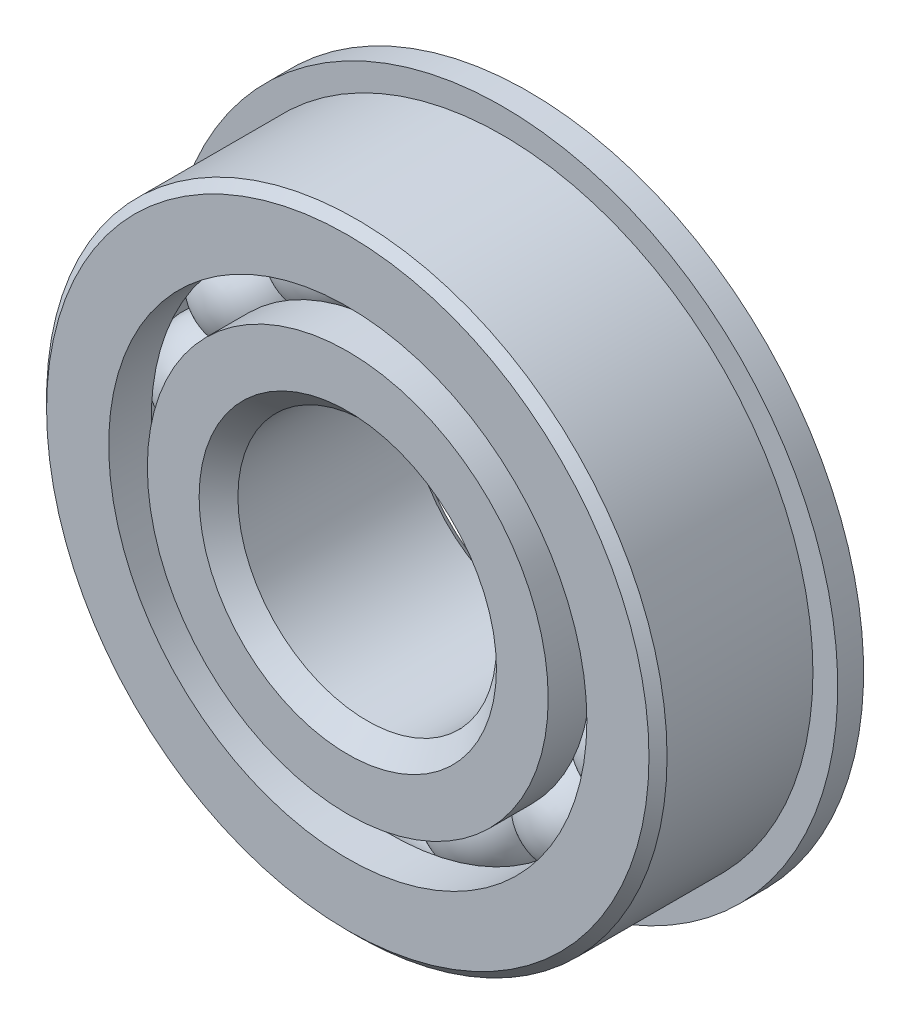
ISO-10303-21;
HEADER;
FILE_DESCRIPTION(('STEP AP214'),'2;1');
FILE_NAME('part.step','',(''),(''),'','','');
FILE_SCHEMA(('AUTOMOTIVE_DESIGN { 1 0 10303 214 1 1 1 1 }'));
ENDSEC;
DATA;
#1=APPLICATION_CONTEXT('core data for automotive mechanical design processes');
#2=APPLICATION_PROTOCOL_DEFINITION('international standard','automotive_design',2000,#1);
#3=PRODUCT_CONTEXT('',#1,'mechanical');
#4=PRODUCT('Part','Part','',(#3));
#5=PRODUCT_RELATED_PRODUCT_CATEGORY('part','',(#4));
#6=PRODUCT_DEFINITION_FORMATION('','',#4);
#7=PRODUCT_DEFINITION_CONTEXT('part definition',#1,'design');
#8=PRODUCT_DEFINITION('design','',#6,#7);
#9=PRODUCT_DEFINITION_SHAPE('','',#8);
#10=(LENGTH_UNIT() NAMED_UNIT(*) SI_UNIT(.MILLI.,.METRE.));
#11=(NAMED_UNIT(*) PLANE_ANGLE_UNIT() SI_UNIT($,.RADIAN.));
#12=(NAMED_UNIT(*) SI_UNIT($,.STERADIAN.) SOLID_ANGLE_UNIT());
#13=UNCERTAINTY_MEASURE_WITH_UNIT(LENGTH_MEASURE(1.E-05),#10,'distance_accuracy_value','');
#14=(GEOMETRIC_REPRESENTATION_CONTEXT(3) GLOBAL_UNCERTAINTY_ASSIGNED_CONTEXT((#13)) GLOBAL_UNIT_ASSIGNED_CONTEXT((#10,
#11,#12)) REPRESENTATION_CONTEXT('',''));
#15=CARTESIAN_POINT('',(0.,0.,0.));
#16=DIRECTION('',(0.,0.,1.));
#17=DIRECTION('',(1.,0.,0.));
#18=AXIS2_PLACEMENT_3D('',#15,#16,#17);
#19=CARTESIAN_POINT('',(-6.27085830276545,11.9481222461581,0.));
#20=DIRECTION('',(0.,0.,1.));
#21=DIRECTION('',(-0.464723172043757,0.885456025653216,0.));
#22=AXIS2_PLACEMENT_3D('',#19,#20,#21);
#23=SPHERICAL_SURFACE('',#22,3.175);
#24=CARTESIAN_POINT('',(-6.27085830276545,11.9481222461581,3.175));
#25=VERTEX_POINT('',#24);
#26=VERTEX_LOOP('',#25);
#27=FACE_BOUND('',#26,.T.);
#28=ADVANCED_FACE('F39',(#27),#23,.T.);
#29=CLOSED_SHELL('',(#28));
#30=MANIFOLD_SOLID_BREP('B2',#29);
#31=CARTESIAN_POINT('',(-11.1051385404024,7.66532367620367,0.));
#32=DIRECTION('',(0.,0.,1.));
#33=DIRECTION('',(-0.822983865893649,0.568064746731166,0.));
#34=AXIS2_PLACEMENT_3D('',#31,#32,#33);
#35=SPHERICAL_SURFACE('',#34,3.175);
#36=CARTESIAN_POINT('',(-11.1051385404024,7.66532367620367,3.175));
#37=VERTEX_POINT('',#36);
#38=VERTEX_LOOP('',#37);
#39=FACE_BOUND('',#38,.T.);
#40=ADVANCED_FACE('F60',(#39),#35,.T.);
#41=CLOSED_SHELL('',(#40));
#42=MANIFOLD_SOLID_BREP('B6',#41);
#43=CARTESIAN_POINT('',(-13.3953653698606,1.62649182919541,0.));
#44=DIRECTION('',(0.,0.,1.));
#45=DIRECTION('',(-0.992708874098053,0.120536680255334,0.));
#46=AXIS2_PLACEMENT_3D('',#43,#44,#45);
#47=SPHERICAL_SURFACE('',#46,3.175);
#48=CARTESIAN_POINT('',(-13.3953653698606,1.62649182919541,3.175));
#49=VERTEX_POINT('',#48);
#50=VERTEX_LOOP('',#49);
#51=FACE_BOUND('',#50,.T.);
#52=ADVANCED_FACE('F81',(#51),#47,.T.);
#53=CLOSED_SHELL('',(#52));
#54=MANIFOLD_SOLID_BREP('B35',#53);
#55=CARTESIAN_POINT('',(-12.6168754247364,-4.7849496945301,0.));
#56=DIRECTION('',(0.,0.,1.));
#57=DIRECTION('',(-0.935016242685418,-0.354604887042527,0.));
#58=AXIS2_PLACEMENT_3D('',#55,#56,#57);
#59=SPHERICAL_SURFACE('',#58,3.175);
#60=CARTESIAN_POINT('',(-12.6168754247364,-4.7849496945301,3.175));
#61=VERTEX_POINT('',#60);
#62=VERTEX_LOOP('',#61);
#63=FACE_BOUND('',#62,.T.);
#64=ADVANCED_FACE('F102',(#63),#59,.T.);
#65=CLOSED_SHELL('',(#64));
#66=MANIFOLD_SOLID_BREP('B56',#65);
#67=CARTESIAN_POINT('',(-8.94801136963682,-10.1002169081337,0.));
#68=DIRECTION('',(0.,0.,1.));
#69=DIRECTION('',(-0.663122658240802,-0.748510748171095,0.));
#70=AXIS2_PLACEMENT_3D('',#67,#68,#69);
#71=SPHERICAL_SURFACE('',#70,3.175);
#72=CARTESIAN_POINT('',(-8.94801136963682,-10.1002169081337,3.175));
#73=VERTEX_POINT('',#72);
#74=VERTEX_LOOP('',#73);
#75=FACE_BOUND('',#74,.T.);
#76=ADVANCED_FACE('F123',(#75),#71,.T.);
#77=CLOSED_SHELL('',(#76));
#78=MANIFOLD_SOLID_BREP('B77',#77);
#79=CARTESIAN_POINT('',(-3.22926574498033,-13.1016461488928,0.));
#80=DIRECTION('',(0.,0.,1.));
#81=DIRECTION('',(-0.239315664287565,-0.97094181742605,0.));
#82=AXIS2_PLACEMENT_3D('',#79,#80,#81);
#83=SPHERICAL_SURFACE('',#82,3.175);
#84=CARTESIAN_POINT('',(-3.22926574498033,-13.1016461488928,3.175));
#85=VERTEX_POINT('',#84);
#86=VERTEX_LOOP('',#85);
#87=FACE_BOUND('',#86,.T.);
#88=ADVANCED_FACE('F144',(#87),#83,.T.);
#89=CLOSED_SHELL('',(#88));
#90=MANIFOLD_SOLID_BREP('B98',#89);
#91=CARTESIAN_POINT('',(3.22926574498015,-13.1016461488928,0.));
#92=DIRECTION('',(0.,0.,1.));
#93=DIRECTION('',(0.239315664287552,-0.970941817426054,0.));
#94=AXIS2_PLACEMENT_3D('',#91,#92,#93);
#95=SPHERICAL_SURFACE('',#94,3.175);
#96=CARTESIAN_POINT('',(3.22926574498015,-13.1016461488928,3.175));
#97=VERTEX_POINT('',#96);
#98=VERTEX_LOOP('',#97);
#99=FACE_BOUND('',#98,.T.);
#100=ADVANCED_FACE('F165',(#99),#95,.T.);
#101=CLOSED_SHELL('',(#100));
#102=MANIFOLD_SOLID_BREP('B119',#101);
#103=CARTESIAN_POINT('',(8.94801136963668,-10.1002169081338,0.));
#104=DIRECTION('',(0.,0.,1.));
#105=DIRECTION('',(0.663122658240791,-0.748510748171105,0.));
#106=AXIS2_PLACEMENT_3D('',#103,#104,#105);
#107=SPHERICAL_SURFACE('',#106,3.175);
#108=CARTESIAN_POINT('',(8.94801136963668,-10.1002169081338,3.175));
#109=VERTEX_POINT('',#108);
#110=VERTEX_LOOP('',#109);
#111=FACE_BOUND('',#110,.T.);
#112=ADVANCED_FACE('F186',(#111),#107,.T.);
#113=CLOSED_SHELL('',(#112));
#114=MANIFOLD_SOLID_BREP('B140',#113);
#115=CARTESIAN_POINT('',(12.6168754247363,-4.78494969453027,0.));
#116=DIRECTION('',(0.,0.,1.));
#117=DIRECTION('',(0.935016242685413,-0.35460488704254,0.));
#118=AXIS2_PLACEMENT_3D('',#115,#116,#117);
#119=SPHERICAL_SURFACE('',#118,3.175);
#120=CARTESIAN_POINT('',(12.6168754247363,-4.78494969453027,3.175));
#121=VERTEX_POINT('',#120);
#122=VERTEX_LOOP('',#121);
#123=FACE_BOUND('',#122,.T.);
#124=ADVANCED_FACE('F207',(#123),#119,.T.);
#125=CLOSED_SHELL('',(#124));
#126=MANIFOLD_SOLID_BREP('B161',#125);
#127=CARTESIAN_POINT('',(13.3953653698606,1.62649182919522,0.));
#128=DIRECTION('',(0.,0.,1.));
#129=DIRECTION('',(0.992708874098054,0.12053668025532,0.));
#130=AXIS2_PLACEMENT_3D('',#127,#128,#129);
#131=SPHERICAL_SURFACE('',#130,3.175);
#132=CARTESIAN_POINT('',(13.3953653698606,1.62649182919522,3.175));
#133=VERTEX_POINT('',#132);
#134=VERTEX_LOOP('',#133);
#135=FACE_BOUND('',#134,.T.);
#136=ADVANCED_FACE('F228',(#135),#131,.T.);
#137=CLOSED_SHELL('',(#136));
#138=MANIFOLD_SOLID_BREP('B182',#137);
#139=CARTESIAN_POINT('',(11.1051385404025,7.66532367620351,0.));
#140=DIRECTION('',(0.,0.,1.));
#141=DIRECTION('',(0.822983865893658,0.568064746731154,0.));
#142=AXIS2_PLACEMENT_3D('',#139,#140,#141);
#143=SPHERICAL_SURFACE('',#142,3.175);
#144=CARTESIAN_POINT('',(11.1051385404025,7.66532367620351,3.175));
#145=VERTEX_POINT('',#144);
#146=VERTEX_LOOP('',#145);
#147=FACE_BOUND('',#146,.T.);
#148=ADVANCED_FACE('F249',(#147),#143,.T.);
#149=CLOSED_SHELL('',(#148));
#150=MANIFOLD_SOLID_BREP('B203',#149);
#151=CARTESIAN_POINT('',(6.27085830276562,11.948122246158,0.));
#152=DIRECTION('',(0.,0.,1.));
#153=DIRECTION('',(0.46472317204377,0.885456025653209,0.));
#154=AXIS2_PLACEMENT_3D('',#151,#152,#153);
#155=SPHERICAL_SURFACE('',#154,3.175);
#156=CARTESIAN_POINT('',(6.27085830276562,11.948122246158,3.175));
#157=VERTEX_POINT('',#156);
#158=VERTEX_LOOP('',#157);
#159=FACE_BOUND('',#158,.T.);
#160=ADVANCED_FACE('F270',(#159),#155,.T.);
#161=CLOSED_SHELL('',(#160));
#162=MANIFOLD_SOLID_BREP('B224',#161);
#163=CARTESIAN_POINT('',(0.,13.49375,0.));
#164=DIRECTION('',(0.,0.,1.));
#165=DIRECTION('',(0.,1.,0.));
#166=AXIS2_PLACEMENT_3D('',#163,#164,#165);
#167=SPHERICAL_SURFACE('',#166,3.175);
#168=CARTESIAN_POINT('',(0.,13.49375,3.175));
#169=VERTEX_POINT('',#168);
#170=VERTEX_LOOP('',#169);
#171=FACE_BOUND('',#170,.T.);
#172=ADVANCED_FACE('F292',(#171),#167,.T.);
#173=CLOSED_SHELL('',(#172));
#174=MANIFOLD_SOLID_BREP('B245',#173);
#175=CARTESIAN_POINT('',(0.,0.,5.5499));
#176=DIRECTION('',(0.,0.,1.));
#177=DIRECTION('',(1.,0.,0.));
#178=AXIS2_PLACEMENT_3D('',#175,#176,#177);
#179=CYLINDRICAL_SURFACE('',#178,12.306928021978);
#180=CARTESIAN_POINT('',(0.,0.,-2.94483931522316));
#181=DIRECTION('',(0.,0.,1.));
#182=DIRECTION('',(1.,0.,0.));
#183=AXIS2_PLACEMENT_3D('',#180,#181,#182);
#184=CIRCLE('',#183,12.306928021978);
#185=CARTESIAN_POINT('',(12.306928021978,0.,-2.94483931522316));
#186=VERTEX_POINT('',#185);
#187=EDGE_CURVE('E323',#186,#186,#184,.T.);
#188=ORIENTED_EDGE('',*,*,#187,.F.);
#189=EDGE_LOOP('',(#188));
#190=FACE_BOUND('',#189,.T.);
#191=CARTESIAN_POINT('',(0.,0.,-6.753225));
#192=DIRECTION('',(0.,0.,1.));
#193=DIRECTION('',(1.,0.,0.));
#194=AXIS2_PLACEMENT_3D('',#191,#192,#193);
#195=CIRCLE('',#194,12.306928021978);
#196=CARTESIAN_POINT('',(12.306928021978,0.,-6.753225));
#197=VERTEX_POINT('',#196);
#198=EDGE_CURVE('E327',#197,#197,#195,.T.);
#199=ORIENTED_EDGE('',*,*,#198,.T.);
#200=EDGE_LOOP('',(#199));
#201=FACE_BOUND('',#200,.T.);
#202=ADVANCED_FACE('F312',(#190,#201),#179,.T.);
#203=CARTESIAN_POINT('',(0.,8.49249,-6.753225));
#204=DIRECTION('',(0.,0.,1.));
#205=DIRECTION('',(1.,0.,0.));
#206=AXIS2_PLACEMENT_3D('',#203,#204,#205);
#207=PLANE('',#206);
#208=ORIENTED_EDGE('',*,*,#198,.F.);
#209=EDGE_LOOP('',(#208));
#210=FACE_BOUND('',#209,.T.);
#211=CARTESIAN_POINT('',(0.,0.,-6.753225));
#212=DIRECTION('',(0.,0.,1.));
#213=DIRECTION('',(1.,0.,0.));
#214=AXIS2_PLACEMENT_3D('',#211,#212,#213);
#215=CIRCLE('',#214,8.49249);
#216=CARTESIAN_POINT('',(8.49249,0.,-6.753225));
#217=VERTEX_POINT('',#216);
#218=EDGE_CURVE('E332',#217,#217,#215,.T.);
#219=ORIENTED_EDGE('',*,*,#218,.T.);
#220=EDGE_LOOP('',(#219));
#221=FACE_BOUND('',#220,.T.);
#222=ADVANCED_FACE('F359',(#210,#221),#207,.F.);
#223=CARTESIAN_POINT('',(0.,0.,-6.198235));
#224=DIRECTION('',(0.,0.,-1.));
#225=DIRECTION('',(-1.,0.,0.));
#226=AXIS2_PLACEMENT_3D('',#223,#224,#225);
#227=CONICAL_SURFACE('',#226,7.9375,0.78539816339745);
#228=ORIENTED_EDGE('',*,*,#218,.F.);
#229=EDGE_LOOP('',(#228));
#230=FACE_BOUND('',#229,.T.);
#231=CARTESIAN_POINT('',(0.,0.,-6.198235));
#232=DIRECTION('',(0.,0.,1.));
#233=DIRECTION('',(1.,0.,0.));
#234=AXIS2_PLACEMENT_3D('',#231,#232,#233);
#235=CIRCLE('',#234,7.9375);
#236=CARTESIAN_POINT('',(7.9375,0.,-6.198235));
#237=VERTEX_POINT('',#236);
#238=EDGE_CURVE('E335',#237,#237,#235,.T.);
#239=ORIENTED_EDGE('',*,*,#238,.T.);
#240=EDGE_LOOP('',(#239));
#241=FACE_BOUND('',#240,.T.);
#242=ADVANCED_FACE('F365',(#230,#241),#227,.F.);
#243=CARTESIAN_POINT('',(0.,0.,5.5499));
#244=DIRECTION('',(0.,0.,1.));
#245=DIRECTION('',(1.,0.,0.));
#246=AXIS2_PLACEMENT_3D('',#243,#244,#245);
#247=CYLINDRICAL_SURFACE('',#246,7.9375);
#248=ORIENTED_EDGE('',*,*,#238,.F.);
#249=EDGE_LOOP('',(#248));
#250=FACE_BOUND('',#249,.T.);
#251=CARTESIAN_POINT('',(0.,0.,4.35927500000001));
#252=DIRECTION('',(0.,0.,1.));
#253=DIRECTION('',(1.,0.,0.));
#254=AXIS2_PLACEMENT_3D('',#251,#252,#253);
#255=CIRCLE('',#254,7.9375);
#256=CARTESIAN_POINT('',(7.9375,0.,4.35927500000001));
#257=VERTEX_POINT('',#256);
#258=EDGE_CURVE('E338',#257,#257,#255,.T.);
#259=ORIENTED_EDGE('',*,*,#258,.T.);
#260=EDGE_LOOP('',(#259));
#261=FACE_BOUND('',#260,.T.);
#262=ADVANCED_FACE('F355',(#250,#261),#247,.F.);
#263=CARTESIAN_POINT('',(0.,0.,5.5499));
#264=DIRECTION('',(0.,0.,1.));
#265=DIRECTION('',(1.,0.,0.));
#266=AXIS2_PLACEMENT_3D('',#263,#264,#265);
#267=CONICAL_SURFACE('',#266,9.128125,0.78539816339745);
#268=ORIENTED_EDGE('',*,*,#258,.F.);
#269=EDGE_LOOP('',(#268));
#270=FACE_BOUND('',#269,.T.);
#271=CARTESIAN_POINT('',(0.,0.,5.5499));
#272=DIRECTION('',(0.,0.,1.));
#273=DIRECTION('',(1.,0.,0.));
#274=AXIS2_PLACEMENT_3D('',#271,#272,#273);
#275=CIRCLE('',#274,9.128125);
#276=CARTESIAN_POINT('',(9.128125,0.,5.5499));
#277=VERTEX_POINT('',#276);
#278=EDGE_CURVE('E341',#277,#277,#275,.T.);
#279=ORIENTED_EDGE('',*,*,#278,.T.);
#280=EDGE_LOOP('',(#279));
#281=FACE_BOUND('',#280,.T.);
#282=ADVANCED_FACE('F345',(#270,#281),#267,.F.);
#283=CARTESIAN_POINT('',(0.,12.306928021978,5.5499));
#284=DIRECTION('',(0.,0.,-1.));
#285=DIRECTION('',(-1.,0.,0.));
#286=AXIS2_PLACEMENT_3D('',#283,#284,#285);
#287=PLANE('',#286);
#288=CARTESIAN_POINT('',(0.,0.,5.5499));
#289=DIRECTION('',(0.,0.,1.));
#290=DIRECTION('',(1.,0.,0.));
#291=AXIS2_PLACEMENT_3D('',#288,#289,#290);
#292=CIRCLE('',#291,12.306928021978);
#293=CARTESIAN_POINT('',(12.306928021978,0.,5.5499));
#294=VERTEX_POINT('',#293);
#295=EDGE_CURVE('E319',#294,#294,#292,.T.);
#296=ORIENTED_EDGE('',*,*,#295,.T.);
#297=EDGE_LOOP('',(#296));
#298=FACE_BOUND('',#297,.T.);
#299=ORIENTED_EDGE('',*,*,#278,.F.);
#300=EDGE_LOOP('',(#299));
#301=FACE_BOUND('',#300,.T.);
#302=ADVANCED_FACE('F314',(#298,#301),#287,.F.);
#303=CARTESIAN_POINT('',(0.,0.,0.));
#304=DIRECTION('',(0.,0.,1.));
#305=DIRECTION('',(1.,0.,0.));
#306=AXIS2_PLACEMENT_3D('',#303,#304,#305);
#307=TOROIDAL_SURFACE('',#306,13.49375,3.175);
#308=CARTESIAN_POINT('',(0.,0.,2.94483931522316));
#309=DIRECTION('',(0.,0.,1.));
#310=DIRECTION('',(1.,0.,0.));
#311=AXIS2_PLACEMENT_3D('',#308,#309,#310);
#312=CIRCLE('',#311,12.306928021978);
#313=CARTESIAN_POINT('',(12.306928021978,0.,2.94483931522316));
#314=VERTEX_POINT('',#313);
#315=EDGE_CURVE('E291',#314,#314,#312,.T.);
#316=ORIENTED_EDGE('',*,*,#315,.F.);
#317=EDGE_LOOP('',(#316));
#318=FACE_BOUND('',#317,.T.);
#319=ORIENTED_EDGE('',*,*,#187,.T.);
#320=EDGE_LOOP('',(#319));
#321=FACE_BOUND('',#320,.T.);
#322=ADVANCED_FACE('F348',(#318,#321),#307,.F.);
#323=CARTESIAN_POINT('',(0.,0.,5.5499));
#324=DIRECTION('',(0.,0.,1.));
#325=DIRECTION('',(1.,0.,0.));
#326=AXIS2_PLACEMENT_3D('',#323,#324,#325);
#327=CYLINDRICAL_SURFACE('',#326,12.306928021978);
#328=ORIENTED_EDGE('',*,*,#295,.F.);
#329=EDGE_LOOP('',(#328));
#330=FACE_BOUND('',#329,.T.);
#331=ORIENTED_EDGE('',*,*,#315,.T.);
#332=EDGE_LOOP('',(#331));
#333=FACE_BOUND('',#332,.T.);
#334=ADVANCED_FACE('F353',(#330,#333),#327,.T.);
#335=CLOSED_SHELL('',(#202,#222,#242,#262,#282,#302,#322,#334));
#336=MANIFOLD_SOLID_BREP('B266',#335);
#337=CARTESIAN_POINT('',(0.,0.,4.99491));
#338=DIRECTION('',(0.,0.,-1.));
#339=DIRECTION('',(-1.,0.,0.));
#340=AXIS2_PLACEMENT_3D('',#337,#338,#339);
#341=CONICAL_SURFACE('',#340,19.05,0.785398163397449);
#342=CARTESIAN_POINT('',(0.,0.,5.5499));
#343=DIRECTION('',(0.,0.,1.));
#344=DIRECTION('',(1.,0.,0.));
#345=AXIS2_PLACEMENT_3D('',#342,#343,#344);
#346=CIRCLE('',#345,18.49501);
#347=CARTESIAN_POINT('',(18.49501,0.,5.5499));
#348=VERTEX_POINT('',#347);
#349=EDGE_CURVE('E462',#348,#348,#346,.T.);
#350=ORIENTED_EDGE('',*,*,#349,.F.);
#351=EDGE_LOOP('',(#350));
#352=FACE_BOUND('',#351,.T.);
#353=CARTESIAN_POINT('',(0.,0.,4.99491));
#354=DIRECTION('',(0.,0.,1.));
#355=DIRECTION('',(1.,0.,0.));
#356=AXIS2_PLACEMENT_3D('',#353,#354,#355);
#357=CIRCLE('',#356,19.05);
#358=CARTESIAN_POINT('',(19.05,0.,4.99491));
#359=VERTEX_POINT('',#358);
#360=EDGE_CURVE('E311',#359,#359,#357,.T.);
#361=ORIENTED_EDGE('',*,*,#360,.T.);
#362=EDGE_LOOP('',(#361));
#363=FACE_BOUND('',#362,.T.);
#364=ADVANCED_FACE('F440',(#352,#363),#341,.T.);
#365=CARTESIAN_POINT('',(0.,0.,5.5499));
#366=DIRECTION('',(0.,0.,1.));
#367=DIRECTION('',(1.,0.,0.));
#368=AXIS2_PLACEMENT_3D('',#365,#366,#367);
#369=CYLINDRICAL_SURFACE('',#368,19.05);
#370=CARTESIAN_POINT('',(0.,0.,-3.96240000000001));
#371=DIRECTION('',(0.,0.,1.));
#372=DIRECTION('',(1.,0.,0.));
#373=AXIS2_PLACEMENT_3D('',#370,#371,#372);
#374=CIRCLE('',#373,19.05);
#375=CARTESIAN_POINT('',(19.05,0.,-3.96240000000001));
#376=VERTEX_POINT('',#375);
#377=EDGE_CURVE('E443',#376,#376,#374,.T.);
#378=ORIENTED_EDGE('',*,*,#377,.T.);
#379=EDGE_LOOP('',(#378));
#380=FACE_BOUND('',#379,.T.);
#381=ORIENTED_EDGE('',*,*,#360,.F.);
#382=EDGE_LOOP('',(#381));
#383=FACE_BOUND('',#382,.T.);
#384=ADVANCED_FACE('F483',(#380,#383),#369,.T.);
#385=CARTESIAN_POINT('',(0.,18.49501,-5.5499));
#386=DIRECTION('',(0.,0.,1.));
#387=DIRECTION('',(1.,0.,0.));
#388=AXIS2_PLACEMENT_3D('',#385,#386,#387);
#389=PLANE('',#388);
#390=CARTESIAN_POINT('',(0.,0.,-5.5499));
#391=DIRECTION('',(0.,0.,1.));
#392=DIRECTION('',(1.,0.,0.));
#393=AXIS2_PLACEMENT_3D('',#390,#391,#392);
#394=CIRCLE('',#393,14.680571978022);
#395=CARTESIAN_POINT('',(14.680571978022,0.,-5.5499));
#396=VERTEX_POINT('',#395);
#397=EDGE_CURVE('E447',#396,#396,#394,.T.);
#398=ORIENTED_EDGE('',*,*,#397,.T.);
#399=EDGE_LOOP('',(#398));
#400=FACE_BOUND('',#399,.T.);
#401=CARTESIAN_POINT('',(0.,0.,-5.54990000000001));
#402=DIRECTION('',(0.,0.,-1.));
#403=DIRECTION('',(-1.,0.,0.));
#404=AXIS2_PLACEMENT_3D('',#401,#402,#403);
#405=CIRCLE('',#404,20.574);
#406=CARTESIAN_POINT('',(-20.574,0.,-5.54990000000001));
#407=VERTEX_POINT('',#406);
#408=EDGE_CURVE('E465',#407,#407,#405,.T.);
#409=ORIENTED_EDGE('',*,*,#408,.T.);
#410=EDGE_LOOP('',(#409));
#411=FACE_BOUND('',#410,.T.);
#412=ADVANCED_FACE('F486',(#400,#411),#389,.F.);
#413=CARTESIAN_POINT('',(0.,0.,5.5499));
#414=DIRECTION('',(0.,0.,1.));
#415=DIRECTION('',(1.,0.,0.));
#416=AXIS2_PLACEMENT_3D('',#413,#414,#415);
#417=CYLINDRICAL_SURFACE('',#416,14.680571978022);
#418=ORIENTED_EDGE('',*,*,#397,.F.);
#419=EDGE_LOOP('',(#418));
#420=FACE_BOUND('',#419,.T.);
#421=CARTESIAN_POINT('',(0.,0.,-2.94483931522316));
#422=DIRECTION('',(0.,0.,1.));
#423=DIRECTION('',(1.,0.,0.));
#424=AXIS2_PLACEMENT_3D('',#421,#422,#423);
#425=CIRCLE('',#424,14.680571978022);
#426=CARTESIAN_POINT('',(14.680571978022,0.,-2.94483931522316));
#427=VERTEX_POINT('',#426);
#428=EDGE_CURVE('E451',#427,#427,#425,.T.);
#429=ORIENTED_EDGE('',*,*,#428,.T.);
#430=EDGE_LOOP('',(#429));
#431=FACE_BOUND('',#430,.T.);
#432=ADVANCED_FACE('F491',(#420,#431),#417,.F.);
#433=CARTESIAN_POINT('',(0.,0.,0.));
#434=DIRECTION('',(0.,0.,1.));
#435=DIRECTION('',(1.,0.,0.));
#436=AXIS2_PLACEMENT_3D('',#433,#434,#435);
#437=TOROIDAL_SURFACE('',#436,13.49375,3.175);
#438=ORIENTED_EDGE('',*,*,#428,.F.);
#439=EDGE_LOOP('',(#438));
#440=FACE_BOUND('',#439,.T.);
#441=CARTESIAN_POINT('',(0.,0.,2.94483931522316));
#442=DIRECTION('',(0.,0.,1.));
#443=DIRECTION('',(1.,0.,0.));
#444=AXIS2_PLACEMENT_3D('',#441,#442,#443);
#445=CIRCLE('',#444,14.680571978022);
#446=CARTESIAN_POINT('',(14.680571978022,0.,2.94483931522316));
#447=VERTEX_POINT('',#446);
#448=EDGE_CURVE('E456',#447,#447,#445,.T.);
#449=ORIENTED_EDGE('',*,*,#448,.T.);
#450=EDGE_LOOP('',(#449));
#451=FACE_BOUND('',#450,.T.);
#452=ADVANCED_FACE('F498',(#440,#451),#437,.F.);
#453=CARTESIAN_POINT('',(0.,0.,5.5499));
#454=DIRECTION('',(0.,0.,1.));
#455=DIRECTION('',(1.,0.,0.));
#456=AXIS2_PLACEMENT_3D('',#453,#454,#455);
#457=CYLINDRICAL_SURFACE('',#456,14.680571978022);
#458=ORIENTED_EDGE('',*,*,#448,.F.);
#459=EDGE_LOOP('',(#458));
#460=FACE_BOUND('',#459,.T.);
#461=CARTESIAN_POINT('',(0.,0.,5.5499));
#462=DIRECTION('',(0.,0.,1.));
#463=DIRECTION('',(1.,0.,0.));
#464=AXIS2_PLACEMENT_3D('',#461,#462,#463);
#465=CIRCLE('',#464,14.680571978022);
#466=CARTESIAN_POINT('',(14.680571978022,0.,5.5499));
#467=VERTEX_POINT('',#466);
#468=EDGE_CURVE('E459',#467,#467,#465,.T.);
#469=ORIENTED_EDGE('',*,*,#468,.T.);
#470=EDGE_LOOP('',(#469));
#471=FACE_BOUND('',#470,.T.);
#472=ADVANCED_FACE('F502',(#460,#471),#457,.F.);
#473=CARTESIAN_POINT('',(0.,18.49501,5.5499));
#474=DIRECTION('',(0.,0.,-1.));
#475=DIRECTION('',(-1.,0.,0.));
#476=AXIS2_PLACEMENT_3D('',#473,#474,#475);
#477=PLANE('',#476);
#478=ORIENTED_EDGE('',*,*,#468,.F.);
#479=EDGE_LOOP('',(#478));
#480=FACE_BOUND('',#479,.T.);
#481=ORIENTED_EDGE('',*,*,#349,.T.);
#482=EDGE_LOOP('',(#481));
#483=FACE_BOUND('',#482,.T.);
#484=ADVANCED_FACE('F478',(#480,#483),#477,.F.);
#485=CARTESIAN_POINT('',(0.,16.587790989011,-3.96240000000001));
#486=DIRECTION('',(0.,0.,1.));
#487=DIRECTION('',(1.,0.,0.));
#488=AXIS2_PLACEMENT_3D('',#485,#486,#487);
#489=PLANE('',#488);
#490=CARTESIAN_POINT('',(0.,0.,-3.96240000000001));
#491=DIRECTION('',(0.,0.,-1.));
#492=DIRECTION('',(-1.,0.,0.));
#493=AXIS2_PLACEMENT_3D('',#490,#491,#492);
#494=CIRCLE('',#493,20.574);
#495=CARTESIAN_POINT('',(-20.574,0.,-3.96240000000001));
#496=VERTEX_POINT('',#495);
#497=EDGE_CURVE('E468',#496,#496,#494,.T.);
#498=ORIENTED_EDGE('',*,*,#497,.F.);
#499=EDGE_LOOP('',(#498));
#500=FACE_BOUND('',#499,.T.);
#501=ORIENTED_EDGE('',*,*,#377,.F.);
#502=EDGE_LOOP('',(#501));
#503=FACE_BOUND('',#502,.T.);
#504=ADVANCED_FACE('F475',(#500,#503),#489,.T.);
#505=CARTESIAN_POINT('',(0.,0.,-6.753225));
#506=DIRECTION('',(0.,0.,-1.));
#507=DIRECTION('',(-1.,0.,0.));
#508=AXIS2_PLACEMENT_3D('',#505,#506,#507);
#509=CYLINDRICAL_SURFACE('',#508,20.574);
#510=ORIENTED_EDGE('',*,*,#497,.T.);
#511=EDGE_LOOP('',(#510));
#512=FACE_BOUND('',#511,.T.);
#513=ORIENTED_EDGE('',*,*,#408,.F.);
#514=EDGE_LOOP('',(#513));
#515=FACE_BOUND('',#514,.T.);
#516=ADVANCED_FACE('F472',(#512,#515),#509,.T.);
#517=CLOSED_SHELL('',(#364,#384,#412,#432,#452,#472,#484,#504,#516));
#518=MANIFOLD_SOLID_BREP('B286',#517);
#519=ADVANCED_BREP_SHAPE_REPRESENTATION('',(#18,#30,#42,#54,#66,#78,#90,#102,#114,#126,#138,
#150,#162,#174,#336,#518),#14);
#520=SHAPE_DEFINITION_REPRESENTATION(#9,#519);
ENDSEC;
END-ISO-10303-21;
